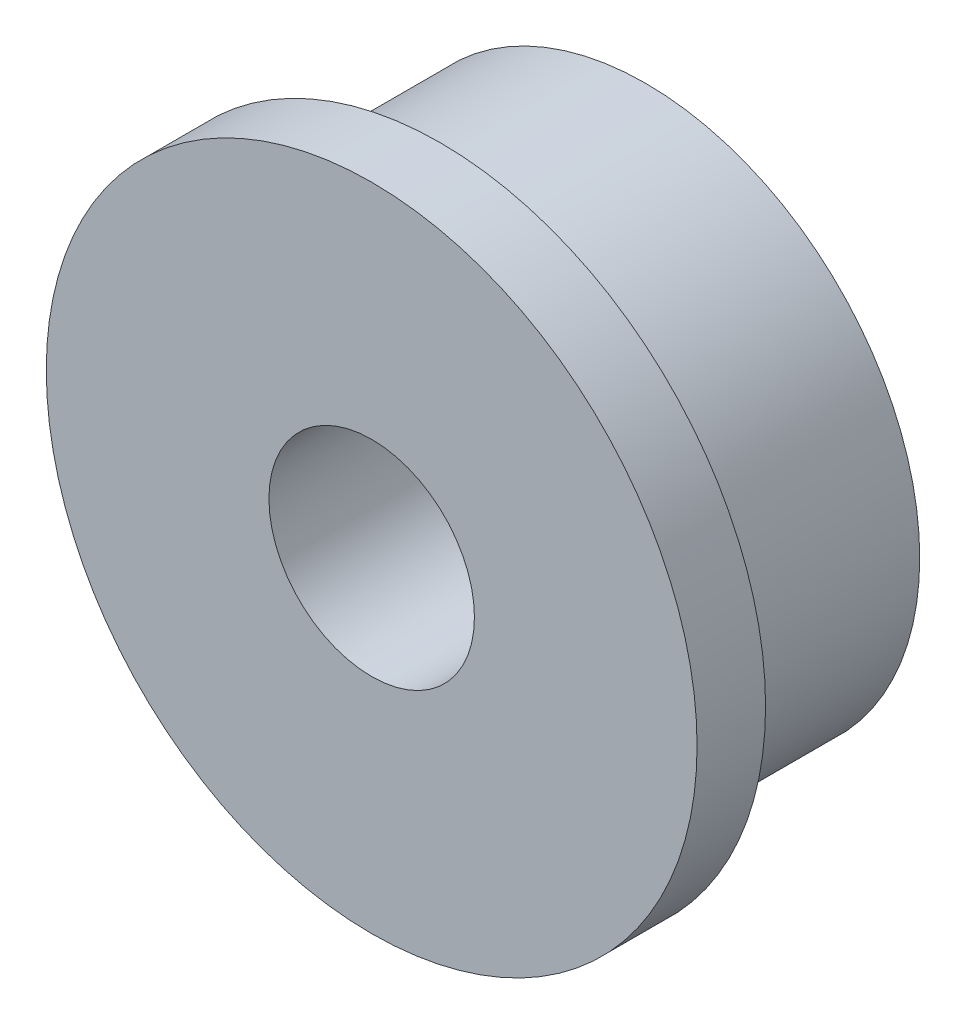
ISO-10303-21;
HEADER;
FILE_DESCRIPTION(('STEP AP214'),'2;1');
FILE_NAME('part.step','',(''),(''),'','','');
FILE_SCHEMA(('AUTOMOTIVE_DESIGN { 1 0 10303 214 1 1 1 1 }'));
ENDSEC;
DATA;
#1=APPLICATION_CONTEXT('core data for automotive mechanical design processes');
#2=APPLICATION_PROTOCOL_DEFINITION('international standard','automotive_design',2000,#1);
#3=PRODUCT_CONTEXT('',#1,'mechanical');
#4=PRODUCT('Part','Part','',(#3));
#5=PRODUCT_RELATED_PRODUCT_CATEGORY('part','',(#4));
#6=PRODUCT_DEFINITION_FORMATION('','',#4);
#7=PRODUCT_DEFINITION_CONTEXT('part definition',#1,'design');
#8=PRODUCT_DEFINITION('design','',#6,#7);
#9=PRODUCT_DEFINITION_SHAPE('','',#8);
#10=(LENGTH_UNIT() NAMED_UNIT(*) SI_UNIT(.MILLI.,.METRE.));
#11=(NAMED_UNIT(*) PLANE_ANGLE_UNIT() SI_UNIT($,.RADIAN.));
#12=(NAMED_UNIT(*) SI_UNIT($,.STERADIAN.) SOLID_ANGLE_UNIT());
#13=UNCERTAINTY_MEASURE_WITH_UNIT(LENGTH_MEASURE(1.E-05),#10,'distance_accuracy_value','');
#14=(GEOMETRIC_REPRESENTATION_CONTEXT(3) GLOBAL_UNCERTAINTY_ASSIGNED_CONTEXT((#13)) GLOBAL_UNIT_ASSIGNED_CONTEXT((#10,
#11,#12)) REPRESENTATION_CONTEXT('',''));
#15=CARTESIAN_POINT('',(0.,0.,0.));
#16=DIRECTION('',(0.,0.,1.));
#17=DIRECTION('',(1.,0.,0.));
#18=AXIS2_PLACEMENT_3D('',#15,#16,#17);
#19=CARTESIAN_POINT('',(0.,0.,-1.));
#20=DIRECTION('',(0.,0.,1.));
#21=DIRECTION('',(1.,0.,0.));
#22=AXIS2_PLACEMENT_3D('',#19,#20,#21);
#23=CYLINDRICAL_SURFACE('',#22,4.75);
#24=CARTESIAN_POINT('',(0.,0.,-1.));
#25=DIRECTION('',(0.,0.,1.));
#26=DIRECTION('',(1.,0.,0.));
#27=AXIS2_PLACEMENT_3D('',#24,#25,#26);
#28=CIRCLE('',#27,4.75);
#29=CARTESIAN_POINT('',(4.75,0.,-1.));
#30=VERTEX_POINT('',#29);
#31=EDGE_CURVE('E10',#30,#30,#28,.T.);
#32=ORIENTED_EDGE('',*,*,#31,.T.);
#33=EDGE_LOOP('',(#32));
#34=FACE_BOUND('',#33,.T.);
#35=CARTESIAN_POINT('',(0.,0.,0.));
#36=DIRECTION('',(0.,0.,1.));
#37=DIRECTION('',(1.,0.,0.));
#38=AXIS2_PLACEMENT_3D('',#35,#36,#37);
#39=CIRCLE('',#38,4.75);
#40=CARTESIAN_POINT('',(4.75,0.,0.));
#41=VERTEX_POINT('',#40);
#42=EDGE_CURVE('E36',#41,#41,#39,.T.);
#43=ORIENTED_EDGE('',*,*,#42,.F.);
#44=EDGE_LOOP('',(#43));
#45=FACE_BOUND('',#44,.T.);
#46=ADVANCED_FACE('F33',(#34,#45),#23,.T.);
#47=CARTESIAN_POINT('',(0.,0.,-1.));
#48=DIRECTION('',(0.,0.,1.));
#49=DIRECTION('',(1.,0.,0.));
#50=AXIS2_PLACEMENT_3D('',#47,#48,#49);
#51=PLANE('',#50);
#52=CARTESIAN_POINT('',(0.,0.,-1.));
#53=DIRECTION('',(0.,0.,1.));
#54=DIRECTION('',(1.,0.,0.));
#55=AXIS2_PLACEMENT_3D('',#52,#53,#54);
#56=CIRCLE('',#55,4.);
#57=CARTESIAN_POINT('',(4.,0.,-1.));
#58=VERTEX_POINT('',#57);
#59=EDGE_CURVE('E43',#58,#58,#56,.T.);
#60=ORIENTED_EDGE('',*,*,#59,.T.);
#61=EDGE_LOOP('',(#60));
#62=FACE_BOUND('',#61,.T.);
#63=ORIENTED_EDGE('',*,*,#31,.F.);
#64=EDGE_LOOP('',(#63));
#65=FACE_BOUND('',#64,.T.);
#66=ADVANCED_FACE('F70',(#62,#65),#51,.F.);
#67=CARTESIAN_POINT('',(0.,0.,0.));
#68=DIRECTION('',(0.,0.,1.));
#69=DIRECTION('',(1.,0.,0.));
#70=AXIS2_PLACEMENT_3D('',#67,#68,#69);
#71=PLANE('',#70);
#72=CARTESIAN_POINT('',(0.,0.,0.));
#73=DIRECTION('',(0.,0.,1.));
#74=DIRECTION('',(1.,0.,0.));
#75=AXIS2_PLACEMENT_3D('',#72,#73,#74);
#76=CIRCLE('',#75,1.5);
#77=CARTESIAN_POINT('',(1.5,0.,0.));
#78=VERTEX_POINT('',#77);
#79=EDGE_CURVE('E51',#78,#78,#76,.T.);
#80=ORIENTED_EDGE('',*,*,#79,.F.);
#81=EDGE_LOOP('',(#80));
#82=FACE_BOUND('',#81,.T.);
#83=ORIENTED_EDGE('',*,*,#42,.T.);
#84=EDGE_LOOP('',(#83));
#85=FACE_BOUND('',#84,.T.);
#86=ADVANCED_FACE('F66',(#82,#85),#71,.T.);
#87=CARTESIAN_POINT('',(0.,0.,-4.));
#88=DIRECTION('',(0.,0.,1.));
#89=DIRECTION('',(1.,0.,0.));
#90=AXIS2_PLACEMENT_3D('',#87,#88,#89);
#91=CYLINDRICAL_SURFACE('',#90,4.);
#92=CARTESIAN_POINT('',(0.,0.,-4.));
#93=DIRECTION('',(0.,0.,1.));
#94=DIRECTION('',(1.,0.,0.));
#95=AXIS2_PLACEMENT_3D('',#92,#93,#94);
#96=CIRCLE('',#95,4.);
#97=CARTESIAN_POINT('',(4.,0.,-4.));
#98=VERTEX_POINT('',#97);
#99=EDGE_CURVE('E47',#98,#98,#96,.T.);
#100=ORIENTED_EDGE('',*,*,#99,.T.);
#101=EDGE_LOOP('',(#100));
#102=FACE_BOUND('',#101,.T.);
#103=ORIENTED_EDGE('',*,*,#59,.F.);
#104=EDGE_LOOP('',(#103));
#105=FACE_BOUND('',#104,.T.);
#106=ADVANCED_FACE('F69',(#102,#105),#91,.T.);
#107=CARTESIAN_POINT('',(0.,0.,-4.));
#108=DIRECTION('',(0.,0.,1.));
#109=DIRECTION('',(1.,0.,0.));
#110=AXIS2_PLACEMENT_3D('',#107,#108,#109);
#111=PLANE('',#110);
#112=CARTESIAN_POINT('',(0.,0.,-4.));
#113=DIRECTION('',(0.,0.,1.));
#114=DIRECTION('',(1.,0.,0.));
#115=AXIS2_PLACEMENT_3D('',#112,#113,#114);
#116=CIRCLE('',#115,1.5);
#117=CARTESIAN_POINT('',(1.5,0.,-4.));
#118=VERTEX_POINT('',#117);
#119=EDGE_CURVE('E50',#118,#118,#116,.T.);
#120=ORIENTED_EDGE('',*,*,#119,.T.);
#121=EDGE_LOOP('',(#120));
#122=FACE_BOUND('',#121,.T.);
#123=ORIENTED_EDGE('',*,*,#99,.F.);
#124=EDGE_LOOP('',(#123));
#125=FACE_BOUND('',#124,.T.);
#126=ADVANCED_FACE('F57',(#122,#125),#111,.F.);
#127=CARTESIAN_POINT('',(0.,0.,-4.));
#128=DIRECTION('',(0.,0.,1.));
#129=DIRECTION('',(1.,0.,0.));
#130=AXIS2_PLACEMENT_3D('',#127,#128,#129);
#131=CYLINDRICAL_SURFACE('',#130,1.5);
#132=ORIENTED_EDGE('',*,*,#119,.F.);
#133=EDGE_LOOP('',(#132));
#134=FACE_BOUND('',#133,.T.);
#135=ORIENTED_EDGE('',*,*,#79,.T.);
#136=EDGE_LOOP('',(#135));
#137=FACE_BOUND('',#136,.T.);
#138=ADVANCED_FACE('F60',(#134,#137),#131,.F.);
#139=CLOSED_SHELL('',(#46,#66,#86,#106,#126,#138));
#140=MANIFOLD_SOLID_BREP('B2',#139);
#141=ADVANCED_BREP_SHAPE_REPRESENTATION('',(#18,#140),#14);
#142=SHAPE_DEFINITION_REPRESENTATION(#9,#141);
ENDSEC;
END-ISO-10303-21;
